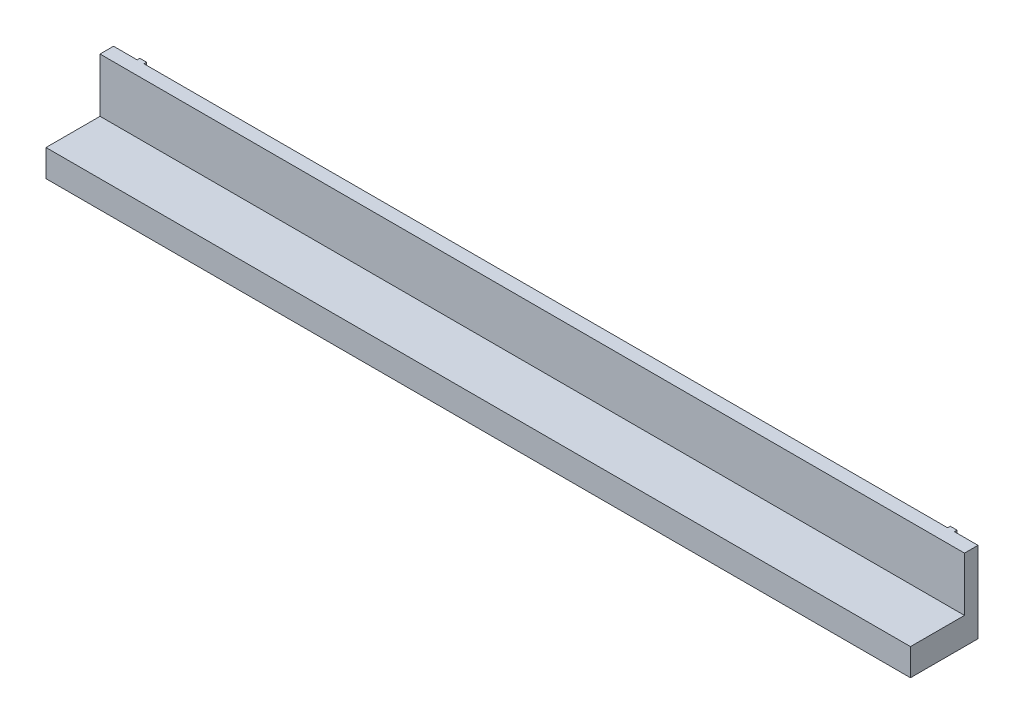
ISO-10303-21;
HEADER;
FILE_DESCRIPTION(('STEP AP214'),'2;1');
FILE_NAME('part.step','',(''),(''),'','','');
FILE_SCHEMA(('AUTOMOTIVE_DESIGN { 1 0 10303 214 1 1 1 1 }'));
ENDSEC;
DATA;
#1=APPLICATION_CONTEXT('core data for automotive mechanical design processes');
#2=APPLICATION_PROTOCOL_DEFINITION('international standard','automotive_design',2000,#1);
#3=PRODUCT_CONTEXT('',#1,'mechanical');
#4=PRODUCT('Part','Part','',(#3));
#5=PRODUCT_RELATED_PRODUCT_CATEGORY('part','',(#4));
#6=PRODUCT_DEFINITION_FORMATION('','',#4);
#7=PRODUCT_DEFINITION_CONTEXT('part definition',#1,'design');
#8=PRODUCT_DEFINITION('design','',#6,#7);
#9=PRODUCT_DEFINITION_SHAPE('','',#8);
#10=(LENGTH_UNIT() NAMED_UNIT(*) SI_UNIT(.MILLI.,.METRE.));
#11=(NAMED_UNIT(*) PLANE_ANGLE_UNIT() SI_UNIT($,.RADIAN.));
#12=(NAMED_UNIT(*) SI_UNIT($,.STERADIAN.) SOLID_ANGLE_UNIT());
#13=UNCERTAINTY_MEASURE_WITH_UNIT(LENGTH_MEASURE(1.E-05),#10,'distance_accuracy_value','');
#14=(GEOMETRIC_REPRESENTATION_CONTEXT(3) GLOBAL_UNCERTAINTY_ASSIGNED_CONTEXT((#13)) GLOBAL_UNIT_ASSIGNED_CONTEXT((#10,
#11,#12)) REPRESENTATION_CONTEXT('',''));
#15=CARTESIAN_POINT('',(0.,0.,0.));
#16=DIRECTION('',(0.,0.,1.));
#17=DIRECTION('',(1.,0.,0.));
#18=AXIS2_PLACEMENT_3D('',#15,#16,#17);
#19=CARTESIAN_POINT('',(0.,0.,0.));
#20=DIRECTION('',(0.,0.,1.));
#21=DIRECTION('',(1.,0.,0.));
#22=AXIS2_PLACEMENT_3D('',#19,#20,#21);
#23=PLANE('',#22);
#24=DIRECTION('',(0.,1.,0.));
#25=VECTOR('',#24,1.);
#26=CARTESIAN_POINT('',(22.2249999999999,76.1148887380693,0.));
#27=LINE('',#26,#25);
#28=CARTESIAN_POINT('',(22.2249999999999,-1.45226271485388E-13,0.));
#29=VERTEX_POINT('',#28);
#30=CARTESIAN_POINT('',(22.2249999999999,76.1148887380693,0.));
#31=VERTEX_POINT('',#30);
#32=EDGE_CURVE('E55',#29,#31,#27,.T.);
#33=ORIENTED_EDGE('',*,*,#32,.F.);
#34=DIRECTION('',(1.,0.,0.));
#35=VECTOR('',#34,1.);
#36=CARTESIAN_POINT('',(0.,0.,0.));
#37=LINE('',#36,#35);
#38=CARTESIAN_POINT('',(0.,0.,0.));
#39=VERTEX_POINT('',#38);
#40=EDGE_CURVE('E249',#39,#29,#37,.T.);
#41=ORIENTED_EDGE('',*,*,#40,.F.);
#42=DIRECTION('',(0.,-1.,0.));
#43=VECTOR('',#42,1.);
#44=CARTESIAN_POINT('',(0.,76.1148887380693,0.));
#45=LINE('',#44,#43);
#46=CARTESIAN_POINT('',(0.,76.1148887380693,0.));
#47=VERTEX_POINT('',#46);
#48=EDGE_CURVE('E234',#47,#39,#45,.T.);
#49=ORIENTED_EDGE('',*,*,#48,.F.);
#50=DIRECTION('',(-1.,0.,0.));
#51=VECTOR('',#50,1.);
#52=CARTESIAN_POINT('',(812.8,76.1148887380693,0.));
#53=LINE('',#52,#51);
#54=EDGE_CURVE('E257',#31,#47,#53,.T.);
#55=ORIENTED_EDGE('',*,*,#54,.F.);
#56=EDGE_LOOP('',(#33,#41,#49,#55));
#57=FACE_BOUND('',#56,.T.);
#58=ADVANCED_FACE('F39',(#57),#23,.F.);
#59=DIRECTION('',(0.,-1.,0.));
#60=VECTOR('',#59,1.);
#61=CARTESIAN_POINT('',(28.5749999999999,76.1148887380693,0.));
#62=LINE('',#61,#60);
#63=CARTESIAN_POINT('',(28.5749999999999,76.1148887380693,0.));
#64=VERTEX_POINT('',#63);
#65=CARTESIAN_POINT('',(28.5749999999999,-1.38777878078145E-13,0.));
#66=VERTEX_POINT('',#65);
#67=EDGE_CURVE('E162',#64,#66,#62,.T.);
#68=ORIENTED_EDGE('',*,*,#67,.F.);
#69=CARTESIAN_POINT('',(784.225,76.1148887380693,0.));
#70=VERTEX_POINT('',#69);
#71=EDGE_CURVE('E63',#70,#64,#53,.T.);
#72=ORIENTED_EDGE('',*,*,#71,.F.);
#73=DIRECTION('',(0.,1.,0.));
#74=VECTOR('',#73,1.);
#75=CARTESIAN_POINT('',(784.225,76.1148887380693,0.));
#76=LINE('',#75,#74);
#77=CARTESIAN_POINT('',(784.225,0.,0.));
#78=VERTEX_POINT('',#77);
#79=EDGE_CURVE('E171',#78,#70,#76,.T.);
#80=ORIENTED_EDGE('',*,*,#79,.F.);
#81=EDGE_CURVE('E254',#66,#78,#37,.T.);
#82=ORIENTED_EDGE('',*,*,#81,.F.);
#83=EDGE_LOOP('',(#68,#72,#80,#82));
#84=FACE_BOUND('',#83,.T.);
#85=ADVANCED_FACE('F293',(#84),#23,.F.);
#86=DIRECTION('',(0.,-1.,0.));
#87=VECTOR('',#86,1.);
#88=CARTESIAN_POINT('',(790.575,76.1148887380693,0.));
#89=LINE('',#88,#87);
#90=CARTESIAN_POINT('',(790.575,76.1148887380693,0.));
#91=VERTEX_POINT('',#90);
#92=CARTESIAN_POINT('',(790.575,-1.45226271485388E-13,0.));
#93=VERTEX_POINT('',#92);
#94=EDGE_CURVE('E166',#91,#93,#89,.T.);
#95=ORIENTED_EDGE('',*,*,#94,.F.);
#96=CARTESIAN_POINT('',(812.8,76.1148887380693,0.));
#97=VERTEX_POINT('',#96);
#98=EDGE_CURVE('E239',#97,#91,#53,.T.);
#99=ORIENTED_EDGE('',*,*,#98,.F.);
#100=DIRECTION('',(0.,1.,0.));
#101=VECTOR('',#100,1.);
#102=CARTESIAN_POINT('',(812.8,0.,0.));
#103=LINE('',#102,#101);
#104=CARTESIAN_POINT('',(812.8,0.,0.));
#105=VERTEX_POINT('',#104);
#106=EDGE_CURVE('E253',#105,#97,#103,.T.);
#107=ORIENTED_EDGE('',*,*,#106,.F.);
#108=EDGE_CURVE('E248',#93,#105,#37,.T.);
#109=ORIENTED_EDGE('',*,*,#108,.F.);
#110=EDGE_LOOP('',(#95,#99,#107,#109));
#111=FACE_BOUND('',#110,.T.);
#112=ADVANCED_FACE('F277',(#111),#23,.F.);
#113=CARTESIAN_POINT('',(0.,0.,12.7));
#114=DIRECTION('',(0.,0.,1.));
#115=DIRECTION('',(1.,0.,0.));
#116=AXIS2_PLACEMENT_3D('',#113,#114,#115);
#117=PLANE('',#116);
#118=DIRECTION('',(0.,-1.,0.));
#119=VECTOR('',#118,1.);
#120=CARTESIAN_POINT('',(0.,76.1148887380693,12.7));
#121=LINE('',#120,#119);
#122=CARTESIAN_POINT('',(0.,76.1148887380693,12.7));
#123=VERTEX_POINT('',#122);
#124=CARTESIAN_POINT('',(0.,25.4,12.7));
#125=VERTEX_POINT('',#124);
#126=EDGE_CURVE('E235',#123,#125,#121,.T.);
#127=ORIENTED_EDGE('',*,*,#126,.T.);
#128=DIRECTION('',(1.,0.,0.));
#129=VECTOR('',#128,1.);
#130=CARTESIAN_POINT('',(0.,25.4,12.7));
#131=LINE('',#130,#129);
#132=CARTESIAN_POINT('',(812.8,25.4,12.7));
#133=VERTEX_POINT('',#132);
#134=EDGE_CURVE('E228',#125,#133,#131,.T.);
#135=ORIENTED_EDGE('',*,*,#134,.T.);
#136=DIRECTION('',(0.,1.,0.));
#137=VECTOR('',#136,1.);
#138=CARTESIAN_POINT('',(812.8,0.,12.7));
#139=LINE('',#138,#137);
#140=CARTESIAN_POINT('',(812.8,76.1148887380693,12.7));
#141=VERTEX_POINT('',#140);
#142=EDGE_CURVE('E238',#133,#141,#139,.T.);
#143=ORIENTED_EDGE('',*,*,#142,.T.);
#144=DIRECTION('',(-1.,0.,0.));
#145=VECTOR('',#144,1.);
#146=CARTESIAN_POINT('',(812.8,76.1148887380693,12.7));
#147=LINE('',#146,#145);
#148=EDGE_CURVE('E242',#141,#123,#147,.T.);
#149=ORIENTED_EDGE('',*,*,#148,.T.);
#150=EDGE_LOOP('',(#127,#135,#143,#149));
#151=FACE_BOUND('',#150,.T.);
#152=ADVANCED_FACE('F305',(#151),#117,.T.);
#153=CARTESIAN_POINT('',(0.,76.1148887380693,12.7));
#154=DIRECTION('',(1.,0.,0.));
#155=DIRECTION('',(0.,0.,-1.));
#156=AXIS2_PLACEMENT_3D('',#153,#154,#155);
#157=PLANE('',#156);
#158=DIRECTION('',(0.,0.,-1.));
#159=VECTOR('',#158,1.);
#160=CARTESIAN_POINT('',(0.,0.,12.7));
#161=LINE('',#160,#159);
#162=CARTESIAN_POINT('',(0.,0.,63.5));
#163=VERTEX_POINT('',#162);
#164=EDGE_CURVE('E11',#163,#39,#161,.T.);
#165=ORIENTED_EDGE('',*,*,#164,.F.);
#166=DIRECTION('',(0.,-1.,0.));
#167=VECTOR('',#166,1.);
#168=CARTESIAN_POINT('',(0.,25.4,63.5));
#169=LINE('',#168,#167);
#170=CARTESIAN_POINT('',(0.,25.4,63.5));
#171=VERTEX_POINT('',#170);
#172=EDGE_CURVE('E224',#171,#163,#169,.T.);
#173=ORIENTED_EDGE('',*,*,#172,.F.);
#174=DIRECTION('',(0.,0.,-1.));
#175=VECTOR('',#174,1.);
#176=CARTESIAN_POINT('',(0.,25.4,12.7));
#177=LINE('',#176,#175);
#178=EDGE_CURVE('E209',#171,#125,#177,.T.);
#179=ORIENTED_EDGE('',*,*,#178,.T.);
#180=ORIENTED_EDGE('',*,*,#126,.F.);
#181=DIRECTION('',(0.,0.,-1.));
#182=VECTOR('',#181,1.);
#183=CARTESIAN_POINT('',(0.,76.1148887380693,12.7));
#184=LINE('',#183,#182);
#185=EDGE_CURVE('E245',#123,#47,#184,.T.);
#186=ORIENTED_EDGE('',*,*,#185,.T.);
#187=ORIENTED_EDGE('',*,*,#48,.T.);
#188=EDGE_LOOP('',(#165,#173,#179,#180,#186,#187));
#189=FACE_BOUND('',#188,.T.);
#190=ADVANCED_FACE('F41',(#189),#157,.F.);
#191=CARTESIAN_POINT('',(0.,0.,12.7));
#192=DIRECTION('',(0.,1.,0.));
#193=DIRECTION('',(0.,0.,1.));
#194=AXIS2_PLACEMENT_3D('',#191,#192,#193);
#195=PLANE('',#194);
#196=ORIENTED_EDGE('',*,*,#40,.T.);
#197=DIRECTION('',(0.,0.,1.));
#198=VECTOR('',#197,1.);
#199=CARTESIAN_POINT('',(22.2249999999999,-1.45226271485388E-13,-2.54));
#200=LINE('',#199,#198);
#201=CARTESIAN_POINT('',(22.2249999999999,-1.45226271485388E-13,-2.54));
#202=VERTEX_POINT('',#201);
#203=EDGE_CURVE('E464',#202,#29,#200,.T.);
#204=ORIENTED_EDGE('',*,*,#203,.F.);
#205=DIRECTION('',(-1.,0.,0.));
#206=VECTOR('',#205,1.);
#207=CARTESIAN_POINT('',(22.2249999999999,-1.45226271485388E-13,-2.54));
#208=LINE('',#207,#206);
#209=CARTESIAN_POINT('',(28.5749999999999,-1.38777878078145E-13,-2.54));
#210=VERTEX_POINT('',#209);
#211=EDGE_CURVE('E159',#210,#202,#208,.T.);
#212=ORIENTED_EDGE('',*,*,#211,.F.);
#213=DIRECTION('',(0.,0.,1.));
#214=VECTOR('',#213,1.);
#215=CARTESIAN_POINT('',(28.5749999999999,-1.38777878078145E-13,-2.54));
#216=LINE('',#215,#214);
#217=EDGE_CURVE('E173',#210,#66,#216,.T.);
#218=ORIENTED_EDGE('',*,*,#217,.T.);
#219=ORIENTED_EDGE('',*,*,#81,.T.);
#220=DIRECTION('',(0.,0.,1.));
#221=VECTOR('',#220,1.);
#222=CARTESIAN_POINT('',(784.225,-1.38777878078145E-13,-2.54));
#223=LINE('',#222,#221);
#224=CARTESIAN_POINT('',(784.225,-1.38777878078145E-13,-2.54));
#225=VERTEX_POINT('',#224);
#226=EDGE_CURVE('E196',#225,#78,#223,.T.);
#227=ORIENTED_EDGE('',*,*,#226,.F.);
#228=DIRECTION('',(-1.,0.,0.));
#229=VECTOR('',#228,1.);
#230=CARTESIAN_POINT('',(790.575,-1.45226271485388E-13,-2.54));
#231=LINE('',#230,#229);
#232=CARTESIAN_POINT('',(790.575,-1.45226271485388E-13,-2.54));
#233=VERTEX_POINT('',#232);
#234=EDGE_CURVE('E184',#233,#225,#231,.T.);
#235=ORIENTED_EDGE('',*,*,#234,.F.);
#236=DIRECTION('',(0.,0.,1.));
#237=VECTOR('',#236,1.);
#238=CARTESIAN_POINT('',(790.575,-1.45226271485388E-13,-2.54));
#239=LINE('',#238,#237);
#240=EDGE_CURVE('E200',#233,#93,#239,.T.);
#241=ORIENTED_EDGE('',*,*,#240,.T.);
#242=ORIENTED_EDGE('',*,*,#108,.T.);
#243=DIRECTION('',(0.,0.,-1.));
#244=VECTOR('',#243,1.);
#245=CARTESIAN_POINT('',(812.8,0.,12.7));
#246=LINE('',#245,#244);
#247=CARTESIAN_POINT('',(812.8,0.,63.5));
#248=VERTEX_POINT('',#247);
#249=EDGE_CURVE('E48',#248,#105,#246,.T.);
#250=ORIENTED_EDGE('',*,*,#249,.F.);
#251=DIRECTION('',(-1.,0.,0.));
#252=VECTOR('',#251,1.);
#253=CARTESIAN_POINT('',(0.,0.,63.5));
#254=LINE('',#253,#252);
#255=EDGE_CURVE('E208',#248,#163,#254,.T.);
#256=ORIENTED_EDGE('',*,*,#255,.T.);
#257=ORIENTED_EDGE('',*,*,#164,.T.);
#258=EDGE_LOOP('',(#196,#204,#212,#218,#219,#227,#235,#241,#242,#250,#256,#257));
#259=FACE_BOUND('',#258,.T.);
#260=ADVANCED_FACE('F297',(#259),#195,.F.);
#261=CARTESIAN_POINT('',(812.8,0.,12.7));
#262=DIRECTION('',(-1.,0.,0.));
#263=DIRECTION('',(0.,0.,1.));
#264=AXIS2_PLACEMENT_3D('',#261,#262,#263);
#265=PLANE('',#264);
#266=ORIENTED_EDGE('',*,*,#106,.T.);
#267=DIRECTION('',(0.,0.,-1.));
#268=VECTOR('',#267,1.);
#269=CARTESIAN_POINT('',(812.8,76.1148887380693,12.7));
#270=LINE('',#269,#268);
#271=EDGE_CURVE('E263',#141,#97,#270,.T.);
#272=ORIENTED_EDGE('',*,*,#271,.F.);
#273=ORIENTED_EDGE('',*,*,#142,.F.);
#274=DIRECTION('',(0.,0.,1.));
#275=VECTOR('',#274,1.);
#276=CARTESIAN_POINT('',(812.8,25.4,0.));
#277=LINE('',#276,#275);
#278=CARTESIAN_POINT('',(812.8,25.4,63.5));
#279=VERTEX_POINT('',#278);
#280=EDGE_CURVE('E213',#133,#279,#277,.T.);
#281=ORIENTED_EDGE('',*,*,#280,.T.);
#282=DIRECTION('',(0.,-1.,0.));
#283=VECTOR('',#282,1.);
#284=CARTESIAN_POINT('',(812.8,25.4,63.5));
#285=LINE('',#284,#283);
#286=EDGE_CURVE('E220',#279,#248,#285,.T.);
#287=ORIENTED_EDGE('',*,*,#286,.T.);
#288=ORIENTED_EDGE('',*,*,#249,.T.);
#289=EDGE_LOOP('',(#266,#272,#273,#281,#287,#288));
#290=FACE_BOUND('',#289,.T.);
#291=ADVANCED_FACE('F270',(#290),#265,.F.);
#292=CARTESIAN_POINT('',(812.8,76.1148887380693,12.7));
#293=DIRECTION('',(0.,-1.,0.));
#294=DIRECTION('',(0.,0.,-1.));
#295=AXIS2_PLACEMENT_3D('',#292,#293,#294);
#296=PLANE('',#295);
#297=ORIENTED_EDGE('',*,*,#98,.T.);
#298=DIRECTION('',(0.,0.,1.));
#299=VECTOR('',#298,1.);
#300=CARTESIAN_POINT('',(790.575,76.1148887380693,-2.54));
#301=LINE('',#300,#299);
#302=CARTESIAN_POINT('',(790.575,76.1148887380693,-2.54));
#303=VERTEX_POINT('',#302);
#304=EDGE_CURVE('E204',#303,#91,#301,.T.);
#305=ORIENTED_EDGE('',*,*,#304,.F.);
#306=DIRECTION('',(1.,0.,0.));
#307=VECTOR('',#306,1.);
#308=CARTESIAN_POINT('',(790.575,76.1148887380693,-2.54));
#309=LINE('',#308,#307);
#310=CARTESIAN_POINT('',(784.225,76.1148887380693,-2.54));
#311=VERTEX_POINT('',#310);
#312=EDGE_CURVE('E177',#311,#303,#309,.T.);
#313=ORIENTED_EDGE('',*,*,#312,.F.);
#314=DIRECTION('',(0.,0.,1.));
#315=VECTOR('',#314,1.);
#316=CARTESIAN_POINT('',(784.225,76.1148887380693,-2.54));
#317=LINE('',#316,#315);
#318=EDGE_CURVE('E189',#311,#70,#317,.T.);
#319=ORIENTED_EDGE('',*,*,#318,.T.);
#320=ORIENTED_EDGE('',*,*,#71,.T.);
#321=DIRECTION('',(0.,0.,1.));
#322=VECTOR('',#321,1.);
#323=CARTESIAN_POINT('',(28.5749999999999,76.1148887380693,-2.54));
#324=LINE('',#323,#322);
#325=CARTESIAN_POINT('',(28.5749999999999,76.1148887380693,-2.54));
#326=VERTEX_POINT('',#325);
#327=EDGE_CURVE('E149',#326,#64,#324,.T.);
#328=ORIENTED_EDGE('',*,*,#327,.F.);
#329=DIRECTION('',(1.,0.,0.));
#330=VECTOR('',#329,1.);
#331=CARTESIAN_POINT('',(22.2249999999999,76.1148887380693,-2.54));
#332=LINE('',#331,#330);
#333=CARTESIAN_POINT('',(22.2249999999999,76.1148887380693,-2.54));
#334=VERTEX_POINT('',#333);
#335=EDGE_CURVE('E143',#334,#326,#332,.T.);
#336=ORIENTED_EDGE('',*,*,#335,.F.);
#337=DIRECTION('',(0.,0.,1.));
#338=VECTOR('',#337,1.);
#339=CARTESIAN_POINT('',(22.2249999999999,76.1148887380693,-2.54));
#340=LINE('',#339,#338);
#341=EDGE_CURVE('E147',#334,#31,#340,.T.);
#342=ORIENTED_EDGE('',*,*,#341,.T.);
#343=ORIENTED_EDGE('',*,*,#54,.T.);
#344=ORIENTED_EDGE('',*,*,#185,.F.);
#345=ORIENTED_EDGE('',*,*,#148,.F.);
#346=ORIENTED_EDGE('',*,*,#271,.T.);
#347=EDGE_LOOP('',(#297,#305,#313,#319,#320,#328,#336,#342,#343,#344,#345,#346));
#348=FACE_BOUND('',#347,.T.);
#349=ADVANCED_FACE('F146',(#348),#296,.F.);
#350=CARTESIAN_POINT('',(0.,25.4,63.5));
#351=DIRECTION('',(0.,0.,1.));
#352=DIRECTION('',(1.,0.,0.));
#353=AXIS2_PLACEMENT_3D('',#350,#351,#352);
#354=PLANE('',#353);
#355=ORIENTED_EDGE('',*,*,#255,.F.);
#356=ORIENTED_EDGE('',*,*,#286,.F.);
#357=DIRECTION('',(-1.,0.,0.));
#358=VECTOR('',#357,1.);
#359=CARTESIAN_POINT('',(0.,25.4,63.5));
#360=LINE('',#359,#358);
#361=EDGE_CURVE('E216',#279,#171,#360,.T.);
#362=ORIENTED_EDGE('',*,*,#361,.T.);
#363=ORIENTED_EDGE('',*,*,#172,.T.);
#364=EDGE_LOOP('',(#355,#356,#362,#363));
#365=FACE_BOUND('',#364,.T.);
#366=ADVANCED_FACE('F323',(#365),#354,.T.);
#367=CARTESIAN_POINT('',(0.,25.4,0.));
#368=DIRECTION('',(0.,-1.,0.));
#369=DIRECTION('',(0.,0.,-1.));
#370=AXIS2_PLACEMENT_3D('',#367,#368,#369);
#371=PLANE('',#370);
#372=ORIENTED_EDGE('',*,*,#134,.F.);
#373=ORIENTED_EDGE('',*,*,#178,.F.);
#374=ORIENTED_EDGE('',*,*,#361,.F.);
#375=ORIENTED_EDGE('',*,*,#280,.F.);
#376=EDGE_LOOP('',(#372,#373,#374,#375));
#377=FACE_BOUND('',#376,.T.);
#378=ADVANCED_FACE('F326',(#377),#371,.F.);
#379=CARTESIAN_POINT('',(790.575,76.1148887380693,-2.54));
#380=DIRECTION('',(-1.,0.,0.));
#381=DIRECTION('',(0.,0.,1.));
#382=AXIS2_PLACEMENT_3D('',#379,#380,#381);
#383=PLANE('',#382);
#384=ORIENTED_EDGE('',*,*,#94,.T.);
#385=ORIENTED_EDGE('',*,*,#240,.F.);
#386=DIRECTION('',(0.,-1.,0.));
#387=VECTOR('',#386,1.);
#388=CARTESIAN_POINT('',(790.575,76.1148887380693,-2.54));
#389=LINE('',#388,#387);
#390=EDGE_CURVE('E181',#303,#233,#389,.T.);
#391=ORIENTED_EDGE('',*,*,#390,.F.);
#392=ORIENTED_EDGE('',*,*,#304,.T.);
#393=EDGE_LOOP('',(#384,#385,#391,#392));
#394=FACE_BOUND('',#393,.T.);
#395=ADVANCED_FACE('F282',(#394),#383,.F.);
#396=CARTESIAN_POINT('',(784.225,76.1148887380693,-2.54));
#397=DIRECTION('',(1.,0.,0.));
#398=DIRECTION('',(0.,0.,-1.));
#399=AXIS2_PLACEMENT_3D('',#396,#397,#398);
#400=PLANE('',#399);
#401=ORIENTED_EDGE('',*,*,#79,.T.);
#402=ORIENTED_EDGE('',*,*,#318,.F.);
#403=DIRECTION('',(0.,1.,0.));
#404=VECTOR('',#403,1.);
#405=CARTESIAN_POINT('',(784.225,76.1148887380693,-2.54));
#406=LINE('',#405,#404);
#407=EDGE_CURVE('E187',#225,#311,#406,.T.);
#408=ORIENTED_EDGE('',*,*,#407,.F.);
#409=ORIENTED_EDGE('',*,*,#226,.T.);
#410=EDGE_LOOP('',(#401,#402,#408,#409));
#411=FACE_BOUND('',#410,.T.);
#412=ADVANCED_FACE('F290',(#411),#400,.F.);
#413=CARTESIAN_POINT('',(0.,0.,-2.54));
#414=DIRECTION('',(0.,0.,1.));
#415=DIRECTION('',(1.,0.,0.));
#416=AXIS2_PLACEMENT_3D('',#413,#414,#415);
#417=PLANE('',#416);
#418=ORIENTED_EDGE('',*,*,#312,.T.);
#419=ORIENTED_EDGE('',*,*,#390,.T.);
#420=ORIENTED_EDGE('',*,*,#234,.T.);
#421=ORIENTED_EDGE('',*,*,#407,.T.);
#422=EDGE_LOOP('',(#418,#419,#420,#421));
#423=FACE_BOUND('',#422,.T.);
#424=ADVANCED_FACE('F286',(#423),#417,.F.);
#425=CARTESIAN_POINT('',(22.2249999999999,76.1148887380693,-2.54));
#426=DIRECTION('',(1.,0.,0.));
#427=DIRECTION('',(0.,0.,-1.));
#428=AXIS2_PLACEMENT_3D('',#425,#426,#427);
#429=PLANE('',#428);
#430=ORIENTED_EDGE('',*,*,#32,.T.);
#431=ORIENTED_EDGE('',*,*,#341,.F.);
#432=DIRECTION('',(0.,1.,0.));
#433=VECTOR('',#432,1.);
#434=CARTESIAN_POINT('',(22.2249999999999,76.1148887380693,-2.54));
#435=LINE('',#434,#433);
#436=EDGE_CURVE('E154',#202,#334,#435,.T.);
#437=ORIENTED_EDGE('',*,*,#436,.F.);
#438=ORIENTED_EDGE('',*,*,#203,.T.);
#439=EDGE_LOOP('',(#430,#431,#437,#438));
#440=FACE_BOUND('',#439,.T.);
#441=ADVANCED_FACE('F164',(#440),#429,.F.);
#442=CARTESIAN_POINT('',(28.5749999999999,76.1148887380693,-2.54));
#443=DIRECTION('',(-1.,0.,0.));
#444=DIRECTION('',(0.,0.,1.));
#445=AXIS2_PLACEMENT_3D('',#442,#443,#444);
#446=PLANE('',#445);
#447=ORIENTED_EDGE('',*,*,#67,.T.);
#448=ORIENTED_EDGE('',*,*,#217,.F.);
#449=DIRECTION('',(0.,-1.,0.));
#450=VECTOR('',#449,1.);
#451=CARTESIAN_POINT('',(28.5749999999999,76.1148887380693,-2.54));
#452=LINE('',#451,#450);
#453=EDGE_CURVE('E153',#326,#210,#452,.T.);
#454=ORIENTED_EDGE('',*,*,#453,.F.);
#455=ORIENTED_EDGE('',*,*,#327,.T.);
#456=EDGE_LOOP('',(#447,#448,#454,#455));
#457=FACE_BOUND('',#456,.T.);
#458=ADVANCED_FACE('F339',(#457),#446,.F.);
#459=CARTESIAN_POINT('',(0.,0.,-2.54));
#460=DIRECTION('',(0.,0.,1.));
#461=DIRECTION('',(1.,0.,0.));
#462=AXIS2_PLACEMENT_3D('',#459,#460,#461);
#463=PLANE('',#462);
#464=ORIENTED_EDGE('',*,*,#436,.T.);
#465=ORIENTED_EDGE('',*,*,#335,.T.);
#466=ORIENTED_EDGE('',*,*,#453,.T.);
#467=ORIENTED_EDGE('',*,*,#211,.T.);
#468=EDGE_LOOP('',(#464,#465,#466,#467));
#469=FACE_BOUND('',#468,.T.);
#470=ADVANCED_FACE('F157',(#469),#463,.F.);
#471=CLOSED_SHELL('',(#58,#85,#112,#152,#190,#260,#291,#349,#366,#378,#395,#412,#424,#441,#458,#470));
#472=MANIFOLD_SOLID_BREP('B2',#471);
#473=ADVANCED_BREP_SHAPE_REPRESENTATION('',(#18,#472),#14);
#474=SHAPE_DEFINITION_REPRESENTATION(#9,#473);
ENDSEC;
END-ISO-10303-21;
